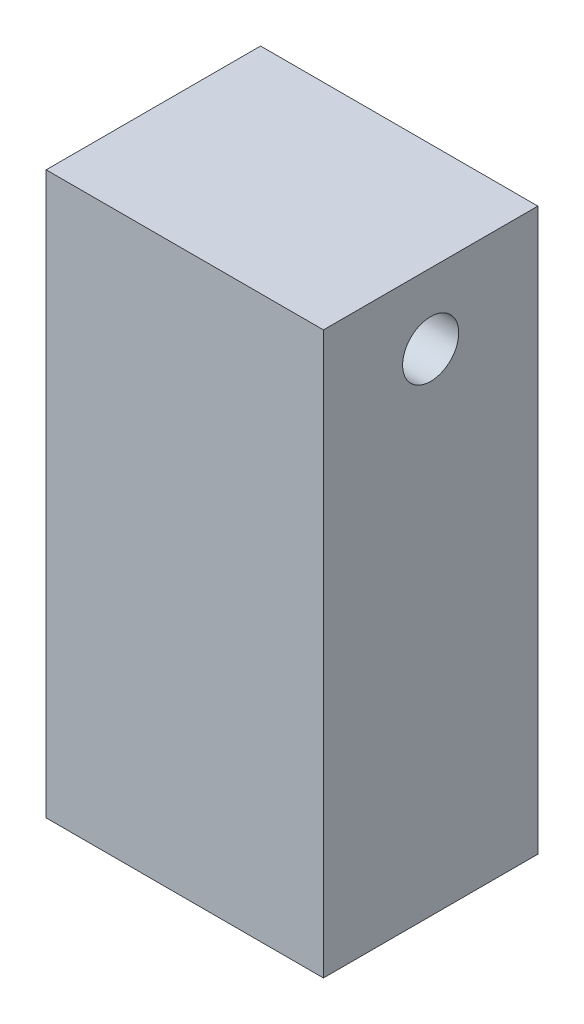
ISO-10303-21;
HEADER;
FILE_DESCRIPTION(('STEP AP214'),'2;1');
FILE_NAME('part.step','',(''),(''),'','','');
FILE_SCHEMA(('AUTOMOTIVE_DESIGN { 1 0 10303 214 1 1 1 1 }'));
ENDSEC;
DATA;
#1=APPLICATION_CONTEXT('core data for automotive mechanical design processes');
#2=APPLICATION_PROTOCOL_DEFINITION('international standard','automotive_design',2000,#1);
#3=PRODUCT_CONTEXT('',#1,'mechanical');
#4=PRODUCT('Part','Part','',(#3));
#5=PRODUCT_RELATED_PRODUCT_CATEGORY('part','',(#4));
#6=PRODUCT_DEFINITION_FORMATION('','',#4);
#7=PRODUCT_DEFINITION_CONTEXT('part definition',#1,'design');
#8=PRODUCT_DEFINITION('design','',#6,#7);
#9=PRODUCT_DEFINITION_SHAPE('','',#8);
#10=(LENGTH_UNIT() NAMED_UNIT(*) SI_UNIT(.MILLI.,.METRE.));
#11=(NAMED_UNIT(*) PLANE_ANGLE_UNIT() SI_UNIT($,.RADIAN.));
#12=(NAMED_UNIT(*) SI_UNIT($,.STERADIAN.) SOLID_ANGLE_UNIT());
#13=UNCERTAINTY_MEASURE_WITH_UNIT(LENGTH_MEASURE(1.E-05),#10,'distance_accuracy_value','');
#14=(GEOMETRIC_REPRESENTATION_CONTEXT(3) GLOBAL_UNCERTAINTY_ASSIGNED_CONTEXT((#13)) GLOBAL_UNIT_ASSIGNED_CONTEXT((#10,
#11,#12)) REPRESENTATION_CONTEXT('',''));
#15=CARTESIAN_POINT('',(0.,0.,0.));
#16=DIRECTION('',(0.,0.,1.));
#17=DIRECTION('',(1.,0.,0.));
#18=AXIS2_PLACEMENT_3D('',#15,#16,#17);
#19=CARTESIAN_POINT('',(-1.56845,6.35,-1.21285));
#20=DIRECTION('',(1.,0.,0.));
#21=DIRECTION('',(0.,0.,-1.));
#22=AXIS2_PLACEMENT_3D('',#19,#20,#21);
#23=PLANE('',#22);
#24=CARTESIAN_POINT('',(-1.56845,5.55625,0.));
#25=DIRECTION('',(1.,0.,0.));
#26=DIRECTION('',(0.,0.,-1.));
#27=AXIS2_PLACEMENT_3D('',#24,#25,#26);
#28=CIRCLE('',#27,0.3175);
#29=CARTESIAN_POINT('',(-1.56845,5.55625,-0.3175));
#30=VERTEX_POINT('',#29);
#31=EDGE_CURVE('E110',#30,#30,#28,.T.);
#32=ORIENTED_EDGE('',*,*,#31,.T.);
#33=EDGE_LOOP('',(#32));
#34=FACE_BOUND('',#33,.T.);
#35=DIRECTION('',(0.,0.,1.));
#36=VECTOR('',#35,1.);
#37=CARTESIAN_POINT('',(-1.56845,0.,-1.21285));
#38=LINE('',#37,#36);
#39=CARTESIAN_POINT('',(-1.56845,0.,-1.21285));
#40=VERTEX_POINT('',#39);
#41=CARTESIAN_POINT('',(-1.56845,0.,1.21285));
#42=VERTEX_POINT('',#41);
#43=EDGE_CURVE('E96',#40,#42,#38,.T.);
#44=ORIENTED_EDGE('',*,*,#43,.T.);
#45=DIRECTION('',(0.,-1.,0.));
#46=VECTOR('',#45,1.);
#47=CARTESIAN_POINT('',(-1.56845,6.35,1.21285));
#48=LINE('',#47,#46);
#49=CARTESIAN_POINT('',(-1.56845,6.35,1.21285));
#50=VERTEX_POINT('',#49);
#51=EDGE_CURVE('E11',#50,#42,#48,.T.);
#52=ORIENTED_EDGE('',*,*,#51,.F.);
#53=DIRECTION('',(0.,0.,1.));
#54=VECTOR('',#53,1.);
#55=CARTESIAN_POINT('',(-1.56845,6.35,-1.21285));
#56=LINE('',#55,#54);
#57=CARTESIAN_POINT('',(-1.56845,6.35,-1.21285));
#58=VERTEX_POINT('',#57);
#59=EDGE_CURVE('E84',#58,#50,#56,.T.);
#60=ORIENTED_EDGE('',*,*,#59,.F.);
#61=DIRECTION('',(0.,-1.,0.));
#62=VECTOR('',#61,1.);
#63=CARTESIAN_POINT('',(-1.56845,6.35,-1.21285));
#64=LINE('',#63,#62);
#65=EDGE_CURVE('E92',#58,#40,#64,.T.);
#66=ORIENTED_EDGE('',*,*,#65,.T.);
#67=EDGE_LOOP('',(#44,#52,#60,#66));
#68=FACE_BOUND('',#67,.T.);
#69=ADVANCED_FACE('F33',(#34,#68),#23,.F.);
#70=CARTESIAN_POINT('',(1.56845,6.35,1.21285));
#71=DIRECTION('',(0.,0.,-1.));
#72=DIRECTION('',(-1.,0.,0.));
#73=AXIS2_PLACEMENT_3D('',#70,#71,#72);
#74=PLANE('',#73);
#75=DIRECTION('',(1.,0.,0.));
#76=VECTOR('',#75,1.);
#77=CARTESIAN_POINT('',(1.56845,0.,1.21285));
#78=LINE('',#77,#76);
#79=CARTESIAN_POINT('',(1.56845,0.,1.21285));
#80=VERTEX_POINT('',#79);
#81=EDGE_CURVE('E88',#42,#80,#78,.T.);
#82=ORIENTED_EDGE('',*,*,#81,.T.);
#83=DIRECTION('',(0.,-1.,0.));
#84=VECTOR('',#83,1.);
#85=CARTESIAN_POINT('',(1.56845,6.35,1.21285));
#86=LINE('',#85,#84);
#87=CARTESIAN_POINT('',(1.56845,6.35,1.21285));
#88=VERTEX_POINT('',#87);
#89=EDGE_CURVE('E41',#88,#80,#86,.T.);
#90=ORIENTED_EDGE('',*,*,#89,.F.);
#91=DIRECTION('',(1.,0.,0.));
#92=VECTOR('',#91,1.);
#93=CARTESIAN_POINT('',(1.56845,6.35,1.21285));
#94=LINE('',#93,#92);
#95=EDGE_CURVE('E79',#50,#88,#94,.T.);
#96=ORIENTED_EDGE('',*,*,#95,.F.);
#97=ORIENTED_EDGE('',*,*,#51,.T.);
#98=EDGE_LOOP('',(#82,#90,#96,#97));
#99=FACE_BOUND('',#98,.T.);
#100=ADVANCED_FACE('F87',(#99),#74,.F.);
#101=CARTESIAN_POINT('',(1.56845,6.35,-1.21285));
#102=DIRECTION('',(-1.,0.,0.));
#103=DIRECTION('',(0.,0.,1.));
#104=AXIS2_PLACEMENT_3D('',#101,#102,#103);
#105=PLANE('',#104);
#106=CARTESIAN_POINT('',(1.56845,5.55625,0.));
#107=DIRECTION('',(1.,0.,0.));
#108=DIRECTION('',(0.,0.,-1.));
#109=AXIS2_PLACEMENT_3D('',#106,#107,#108);
#110=CIRCLE('',#109,0.3175);
#111=CARTESIAN_POINT('',(1.56845,5.55625,-0.317500000000001));
#112=VERTEX_POINT('',#111);
#113=EDGE_CURVE('E99',#112,#112,#110,.T.);
#114=ORIENTED_EDGE('',*,*,#113,.F.);
#115=EDGE_LOOP('',(#114));
#116=FACE_BOUND('',#115,.T.);
#117=DIRECTION('',(0.,0.,-1.));
#118=VECTOR('',#117,1.);
#119=CARTESIAN_POINT('',(1.56845,0.,-1.21285));
#120=LINE('',#119,#118);
#121=CARTESIAN_POINT('',(1.56845,0.,-1.21285));
#122=VERTEX_POINT('',#121);
#123=EDGE_CURVE('E66',#80,#122,#120,.T.);
#124=ORIENTED_EDGE('',*,*,#123,.T.);
#125=DIRECTION('',(0.,-1.,0.));
#126=VECTOR('',#125,1.);
#127=CARTESIAN_POINT('',(1.56845,6.35,-1.21285));
#128=LINE('',#127,#126);
#129=CARTESIAN_POINT('',(1.56845,6.35,-1.21285));
#130=VERTEX_POINT('',#129);
#131=EDGE_CURVE('E89',#130,#122,#128,.T.);
#132=ORIENTED_EDGE('',*,*,#131,.F.);
#133=DIRECTION('',(0.,0.,-1.));
#134=VECTOR('',#133,1.);
#135=CARTESIAN_POINT('',(1.56845,6.35,-1.21285));
#136=LINE('',#135,#134);
#137=EDGE_CURVE('E82',#88,#130,#136,.T.);
#138=ORIENTED_EDGE('',*,*,#137,.F.);
#139=ORIENTED_EDGE('',*,*,#89,.T.);
#140=EDGE_LOOP('',(#124,#132,#138,#139));
#141=FACE_BOUND('',#140,.T.);
#142=ADVANCED_FACE('F90',(#116,#141),#105,.F.);
#143=CARTESIAN_POINT('',(1.56845,6.35,-1.21285));
#144=DIRECTION('',(0.,0.,1.));
#145=DIRECTION('',(1.,0.,0.));
#146=AXIS2_PLACEMENT_3D('',#143,#144,#145);
#147=PLANE('',#146);
#148=DIRECTION('',(-1.,0.,0.));
#149=VECTOR('',#148,1.);
#150=CARTESIAN_POINT('',(1.56845,0.,-1.21285));
#151=LINE('',#150,#149);
#152=EDGE_CURVE('E72',#122,#40,#151,.T.);
#153=ORIENTED_EDGE('',*,*,#152,.T.);
#154=ORIENTED_EDGE('',*,*,#65,.F.);
#155=DIRECTION('',(-1.,0.,0.));
#156=VECTOR('',#155,1.);
#157=CARTESIAN_POINT('',(1.56845,6.35,-1.21285));
#158=LINE('',#157,#156);
#159=EDGE_CURVE('E49',#130,#58,#158,.T.);
#160=ORIENTED_EDGE('',*,*,#159,.F.);
#161=ORIENTED_EDGE('',*,*,#131,.T.);
#162=EDGE_LOOP('',(#153,#154,#160,#161));
#163=FACE_BOUND('',#162,.T.);
#164=ADVANCED_FACE('F104',(#163),#147,.F.);
#165=CARTESIAN_POINT('',(0.,6.35,0.));
#166=DIRECTION('',(0.,-1.,0.));
#167=DIRECTION('',(0.,0.,-1.));
#168=AXIS2_PLACEMENT_3D('',#165,#166,#167);
#169=PLANE('',#168);
#170=ORIENTED_EDGE('',*,*,#59,.T.);
#171=ORIENTED_EDGE('',*,*,#95,.T.);
#172=ORIENTED_EDGE('',*,*,#137,.T.);
#173=ORIENTED_EDGE('',*,*,#159,.T.);
#174=EDGE_LOOP('',(#170,#171,#172,#173));
#175=FACE_BOUND('',#174,.T.);
#176=ADVANCED_FACE('F80',(#175),#169,.F.);
#177=CARTESIAN_POINT('',(0.,0.,0.));
#178=DIRECTION('',(0.,-1.,0.));
#179=DIRECTION('',(0.,0.,-1.));
#180=AXIS2_PLACEMENT_3D('',#177,#178,#179);
#181=PLANE('',#180);
#182=ORIENTED_EDGE('',*,*,#43,.F.);
#183=ORIENTED_EDGE('',*,*,#152,.F.);
#184=ORIENTED_EDGE('',*,*,#123,.F.);
#185=ORIENTED_EDGE('',*,*,#81,.F.);
#186=EDGE_LOOP('',(#182,#183,#184,#185));
#187=FACE_BOUND('',#186,.T.);
#188=ADVANCED_FACE('F107',(#187),#181,.T.);
#189=CARTESIAN_POINT('',(1.56845,5.55625,0.));
#190=DIRECTION('',(-1.,0.,0.));
#191=DIRECTION('',(0.,0.,1.));
#192=AXIS2_PLACEMENT_3D('',#189,#190,#191);
#193=CYLINDRICAL_SURFACE('',#192,0.3175);
#194=ORIENTED_EDGE('',*,*,#113,.T.);
#195=EDGE_LOOP('',(#194));
#196=FACE_BOUND('',#195,.T.);
#197=ORIENTED_EDGE('',*,*,#31,.F.);
#198=EDGE_LOOP('',(#197));
#199=FACE_BOUND('',#198,.T.);
#200=ADVANCED_FACE('F116',(#196,#199),#193,.F.);
#201=CLOSED_SHELL('',(#69,#100,#142,#164,#176,#188,#200));
#202=MANIFOLD_SOLID_BREP('B2',#201);
#203=ADVANCED_BREP_SHAPE_REPRESENTATION('',(#18,#202),#14);
#204=SHAPE_DEFINITION_REPRESENTATION(#9,#203);
ENDSEC;
END-ISO-10303-21;
